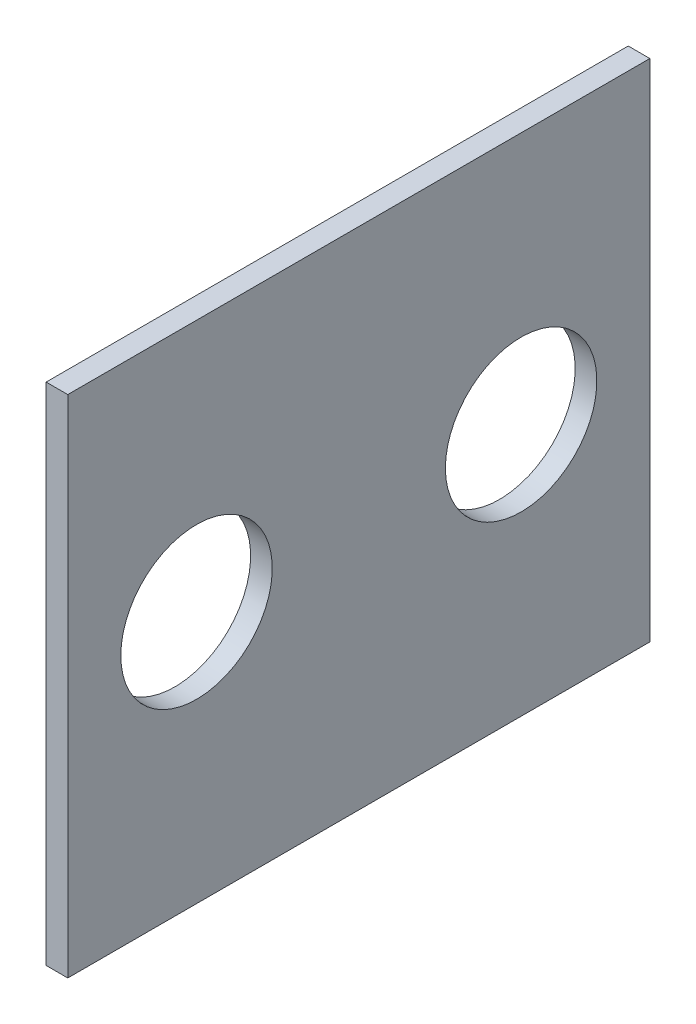
ISO-10303-21;
HEADER;
FILE_DESCRIPTION(('STEP AP214'),'2;1');
FILE_NAME('part.step','',(''),(''),'','','');
FILE_SCHEMA(('AUTOMOTIVE_DESIGN { 1 0 10303 214 1 1 1 1 }'));
ENDSEC;
DATA;
#1=APPLICATION_CONTEXT('core data for automotive mechanical design processes');
#2=APPLICATION_PROTOCOL_DEFINITION('international standard','automotive_design',2000,#1);
#3=PRODUCT_CONTEXT('',#1,'mechanical');
#4=PRODUCT('Part','Part','',(#3));
#5=PRODUCT_RELATED_PRODUCT_CATEGORY('part','',(#4));
#6=PRODUCT_DEFINITION_FORMATION('','',#4);
#7=PRODUCT_DEFINITION_CONTEXT('part definition',#1,'design');
#8=PRODUCT_DEFINITION('design','',#6,#7);
#9=PRODUCT_DEFINITION_SHAPE('','',#8);
#10=(LENGTH_UNIT() NAMED_UNIT(*) SI_UNIT(.MILLI.,.METRE.));
#11=(NAMED_UNIT(*) PLANE_ANGLE_UNIT() SI_UNIT($,.RADIAN.));
#12=(NAMED_UNIT(*) SI_UNIT($,.STERADIAN.) SOLID_ANGLE_UNIT());
#13=UNCERTAINTY_MEASURE_WITH_UNIT(LENGTH_MEASURE(1.E-05),#10,'distance_accuracy_value','');
#14=(GEOMETRIC_REPRESENTATION_CONTEXT(3) GLOBAL_UNCERTAINTY_ASSIGNED_CONTEXT((#13)) GLOBAL_UNIT_ASSIGNED_CONTEXT((#10,
#11,#12)) REPRESENTATION_CONTEXT('',''));
#15=CARTESIAN_POINT('',(0.,0.,0.));
#16=DIRECTION('',(0.,0.,1.));
#17=DIRECTION('',(1.,0.,0.));
#18=AXIS2_PLACEMENT_3D('',#15,#16,#17);
#19=CARTESIAN_POINT('',(-0.5,-11.675,-13.45));
#20=DIRECTION('',(0.,0.,-1.));
#21=DIRECTION('',(-1.,0.,0.));
#22=AXIS2_PLACEMENT_3D('',#19,#20,#21);
#23=PLANE('',#22);
#24=DIRECTION('',(0.,1.,0.));
#25=VECTOR('',#24,1.);
#26=CARTESIAN_POINT('',(0.5,-11.675,-13.45));
#27=LINE('',#26,#25);
#28=CARTESIAN_POINT('',(0.5,-11.675,-13.45));
#29=VERTEX_POINT('',#28);
#30=CARTESIAN_POINT('',(0.5,11.675,-13.45));
#31=VERTEX_POINT('',#30);
#32=EDGE_CURVE('E107',#29,#31,#27,.T.);
#33=ORIENTED_EDGE('',*,*,#32,.F.);
#34=DIRECTION('',(1.,0.,0.));
#35=VECTOR('',#34,1.);
#36=CARTESIAN_POINT('',(-0.5,-11.675,-13.45));
#37=LINE('',#36,#35);
#38=CARTESIAN_POINT('',(-0.5,-11.675,-13.45));
#39=VERTEX_POINT('',#38);
#40=EDGE_CURVE('E11',#39,#29,#37,.T.);
#41=ORIENTED_EDGE('',*,*,#40,.F.);
#42=DIRECTION('',(0.,1.,0.));
#43=VECTOR('',#42,1.);
#44=CARTESIAN_POINT('',(-0.5,-11.675,-13.45));
#45=LINE('',#44,#43);
#46=CARTESIAN_POINT('',(-0.5,11.675,-13.45));
#47=VERTEX_POINT('',#46);
#48=EDGE_CURVE('E101',#39,#47,#45,.T.);
#49=ORIENTED_EDGE('',*,*,#48,.T.);
#50=DIRECTION('',(1.,0.,0.));
#51=VECTOR('',#50,1.);
#52=CARTESIAN_POINT('',(-0.5,11.675,-13.45));
#53=LINE('',#52,#51);
#54=EDGE_CURVE('E46',#47,#31,#53,.T.);
#55=ORIENTED_EDGE('',*,*,#54,.T.);
#56=EDGE_LOOP('',(#33,#41,#49,#55));
#57=FACE_BOUND('',#56,.T.);
#58=ADVANCED_FACE('F43',(#57),#23,.T.);
#59=CARTESIAN_POINT('',(-0.5,-11.675,13.45));
#60=DIRECTION('',(0.,-1.,0.));
#61=DIRECTION('',(0.,0.,-1.));
#62=AXIS2_PLACEMENT_3D('',#59,#60,#61);
#63=PLANE('',#62);
#64=DIRECTION('',(0.,0.,-1.));
#65=VECTOR('',#64,1.);
#66=CARTESIAN_POINT('',(0.5,-11.675,13.45));
#67=LINE('',#66,#65);
#68=CARTESIAN_POINT('',(0.5,-11.675,13.45));
#69=VERTEX_POINT('',#68);
#70=EDGE_CURVE('E103',#69,#29,#67,.T.);
#71=ORIENTED_EDGE('',*,*,#70,.F.);
#72=DIRECTION('',(1.,0.,0.));
#73=VECTOR('',#72,1.);
#74=CARTESIAN_POINT('',(-0.5,-11.675,13.45));
#75=LINE('',#74,#73);
#76=CARTESIAN_POINT('',(-0.5,-11.675,13.45));
#77=VERTEX_POINT('',#76);
#78=EDGE_CURVE('E55',#77,#69,#75,.T.);
#79=ORIENTED_EDGE('',*,*,#78,.F.);
#80=DIRECTION('',(0.,0.,-1.));
#81=VECTOR('',#80,1.);
#82=CARTESIAN_POINT('',(-0.5,-11.675,13.45));
#83=LINE('',#82,#81);
#84=EDGE_CURVE('E98',#77,#39,#83,.T.);
#85=ORIENTED_EDGE('',*,*,#84,.T.);
#86=ORIENTED_EDGE('',*,*,#40,.T.);
#87=EDGE_LOOP('',(#71,#79,#85,#86));
#88=FACE_BOUND('',#87,.T.);
#89=ADVANCED_FACE('F116',(#88),#63,.T.);
#90=CARTESIAN_POINT('',(-0.5,-11.675,13.45));
#91=DIRECTION('',(0.,0.,1.));
#92=DIRECTION('',(1.,0.,0.));
#93=AXIS2_PLACEMENT_3D('',#90,#91,#92);
#94=PLANE('',#93);
#95=DIRECTION('',(0.,-1.,0.));
#96=VECTOR('',#95,1.);
#97=CARTESIAN_POINT('',(0.5,-11.675,13.45));
#98=LINE('',#97,#96);
#99=CARTESIAN_POINT('',(0.5,11.675,13.45));
#100=VERTEX_POINT('',#99);
#101=EDGE_CURVE('E91',#100,#69,#98,.T.);
#102=ORIENTED_EDGE('',*,*,#101,.F.);
#103=DIRECTION('',(1.,0.,0.));
#104=VECTOR('',#103,1.);
#105=CARTESIAN_POINT('',(-0.5,11.675,13.45));
#106=LINE('',#105,#104);
#107=CARTESIAN_POINT('',(-0.5,11.675,13.45));
#108=VERTEX_POINT('',#107);
#109=EDGE_CURVE('E86',#108,#100,#106,.T.);
#110=ORIENTED_EDGE('',*,*,#109,.F.);
#111=DIRECTION('',(0.,-1.,0.));
#112=VECTOR('',#111,1.);
#113=CARTESIAN_POINT('',(-0.5,-11.675,13.45));
#114=LINE('',#113,#112);
#115=EDGE_CURVE('E93',#108,#77,#114,.T.);
#116=ORIENTED_EDGE('',*,*,#115,.T.);
#117=ORIENTED_EDGE('',*,*,#78,.T.);
#118=EDGE_LOOP('',(#102,#110,#116,#117));
#119=FACE_BOUND('',#118,.T.);
#120=ADVANCED_FACE('F89',(#119),#94,.T.);
#121=CARTESIAN_POINT('',(-0.5,11.675,13.45));
#122=DIRECTION('',(0.,1.,0.));
#123=DIRECTION('',(0.,0.,1.));
#124=AXIS2_PLACEMENT_3D('',#121,#122,#123);
#125=PLANE('',#124);
#126=DIRECTION('',(0.,0.,1.));
#127=VECTOR('',#126,1.);
#128=CARTESIAN_POINT('',(0.5,11.675,13.45));
#129=LINE('',#128,#127);
#130=EDGE_CURVE('E112',#31,#100,#129,.T.);
#131=ORIENTED_EDGE('',*,*,#130,.F.);
#132=ORIENTED_EDGE('',*,*,#54,.F.);
#133=DIRECTION('',(0.,0.,1.));
#134=VECTOR('',#133,1.);
#135=CARTESIAN_POINT('',(-0.5,11.675,13.45));
#136=LINE('',#135,#134);
#137=EDGE_CURVE('E100',#47,#108,#136,.T.);
#138=ORIENTED_EDGE('',*,*,#137,.T.);
#139=ORIENTED_EDGE('',*,*,#109,.T.);
#140=EDGE_LOOP('',(#131,#132,#138,#139));
#141=FACE_BOUND('',#140,.T.);
#142=ADVANCED_FACE('F99',(#141),#125,.T.);
#143=CARTESIAN_POINT('',(-0.5,0.,0.));
#144=DIRECTION('',(-1.,0.,0.));
#145=DIRECTION('',(0.,0.,1.));
#146=AXIS2_PLACEMENT_3D('',#143,#144,#145);
#147=PLANE('',#146);
#148=CARTESIAN_POINT('',(-0.5,0.,-7.50000000000009));
#149=DIRECTION('',(-1.,0.,0.));
#150=DIRECTION('',(0.,0.,1.));
#151=AXIS2_PLACEMENT_3D('',#148,#149,#150);
#152=CIRCLE('',#151,3.5);
#153=CARTESIAN_POINT('',(-0.5,0.,-4.00000000000009));
#154=VERTEX_POINT('',#153);
#155=EDGE_CURVE('E152',#154,#154,#152,.T.);
#156=ORIENTED_EDGE('',*,*,#155,.F.);
#157=EDGE_LOOP('',(#156));
#158=FACE_BOUND('',#157,.T.);
#159=CARTESIAN_POINT('',(-0.5,0.,7.49999999999991));
#160=DIRECTION('',(-1.,0.,0.));
#161=DIRECTION('',(0.,0.,1.));
#162=AXIS2_PLACEMENT_3D('',#159,#160,#161);
#163=CIRCLE('',#162,3.5);
#164=CARTESIAN_POINT('',(-0.5,0.,10.9999999999999));
#165=VERTEX_POINT('',#164);
#166=EDGE_CURVE('E154',#165,#165,#163,.T.);
#167=ORIENTED_EDGE('',*,*,#166,.F.);
#168=EDGE_LOOP('',(#167));
#169=FACE_BOUND('',#168,.T.);
#170=ORIENTED_EDGE('',*,*,#48,.F.);
#171=ORIENTED_EDGE('',*,*,#84,.F.);
#172=ORIENTED_EDGE('',*,*,#115,.F.);
#173=ORIENTED_EDGE('',*,*,#137,.F.);
#174=EDGE_LOOP('',(#170,#171,#172,#173));
#175=FACE_BOUND('',#174,.T.);
#176=ADVANCED_FACE('F96',(#158,#169,#175),#147,.T.);
#177=CARTESIAN_POINT('',(0.5,0.,0.));
#178=DIRECTION('',(-1.,0.,0.));
#179=DIRECTION('',(0.,0.,1.));
#180=AXIS2_PLACEMENT_3D('',#177,#178,#179);
#181=PLANE('',#180);
#182=CARTESIAN_POINT('',(0.5,0.,-7.50000000000009));
#183=DIRECTION('',(-1.,0.,0.));
#184=DIRECTION('',(0.,0.,1.));
#185=AXIS2_PLACEMENT_3D('',#182,#183,#184);
#186=CIRCLE('',#185,3.5);
#187=CARTESIAN_POINT('',(0.5,0.,-4.00000000000009));
#188=VERTEX_POINT('',#187);
#189=EDGE_CURVE('E115',#188,#188,#186,.T.);
#190=ORIENTED_EDGE('',*,*,#189,.T.);
#191=EDGE_LOOP('',(#190));
#192=FACE_BOUND('',#191,.T.);
#193=CARTESIAN_POINT('',(0.5,0.,7.49999999999991));
#194=DIRECTION('',(-1.,0.,0.));
#195=DIRECTION('',(0.,0.,1.));
#196=AXIS2_PLACEMENT_3D('',#193,#194,#195);
#197=CIRCLE('',#196,3.5);
#198=CARTESIAN_POINT('',(0.5,0.,10.9999999999999));
#199=VERTEX_POINT('',#198);
#200=EDGE_CURVE('E157',#199,#199,#197,.T.);
#201=ORIENTED_EDGE('',*,*,#200,.T.);
#202=EDGE_LOOP('',(#201));
#203=FACE_BOUND('',#202,.T.);
#204=ORIENTED_EDGE('',*,*,#32,.T.);
#205=ORIENTED_EDGE('',*,*,#130,.T.);
#206=ORIENTED_EDGE('',*,*,#101,.T.);
#207=ORIENTED_EDGE('',*,*,#70,.T.);
#208=EDGE_LOOP('',(#204,#205,#206,#207));
#209=FACE_BOUND('',#208,.T.);
#210=ADVANCED_FACE('F119',(#192,#203,#209),#181,.F.);
#211=CARTESIAN_POINT('',(0.5,0.,7.49999999999991));
#212=DIRECTION('',(-1.,0.,0.));
#213=DIRECTION('',(0.,0.,1.));
#214=AXIS2_PLACEMENT_3D('',#211,#212,#213);
#215=CYLINDRICAL_SURFACE('',#214,3.5);
#216=ORIENTED_EDGE('',*,*,#200,.F.);
#217=EDGE_LOOP('',(#216));
#218=FACE_BOUND('',#217,.T.);
#219=ORIENTED_EDGE('',*,*,#166,.T.);
#220=EDGE_LOOP('',(#219));
#221=FACE_BOUND('',#220,.T.);
#222=ADVANCED_FACE('F140',(#218,#221),#215,.F.);
#223=CARTESIAN_POINT('',(0.5,0.,-7.50000000000009));
#224=DIRECTION('',(-1.,0.,0.));
#225=DIRECTION('',(0.,0.,1.));
#226=AXIS2_PLACEMENT_3D('',#223,#224,#225);
#227=CYLINDRICAL_SURFACE('',#226,3.5);
#228=ORIENTED_EDGE('',*,*,#189,.F.);
#229=EDGE_LOOP('',(#228));
#230=FACE_BOUND('',#229,.T.);
#231=ORIENTED_EDGE('',*,*,#155,.T.);
#232=EDGE_LOOP('',(#231));
#233=FACE_BOUND('',#232,.T.);
#234=ADVANCED_FACE('F145',(#230,#233),#227,.F.);
#235=CLOSED_SHELL('',(#58,#89,#120,#142,#176,#210,#222,#234));
#236=MANIFOLD_SOLID_BREP('B2',#235);
#237=ADVANCED_BREP_SHAPE_REPRESENTATION('',(#18,#236),#14);
#238=SHAPE_DEFINITION_REPRESENTATION(#9,#237);
ENDSEC;
END-ISO-10303-21;
